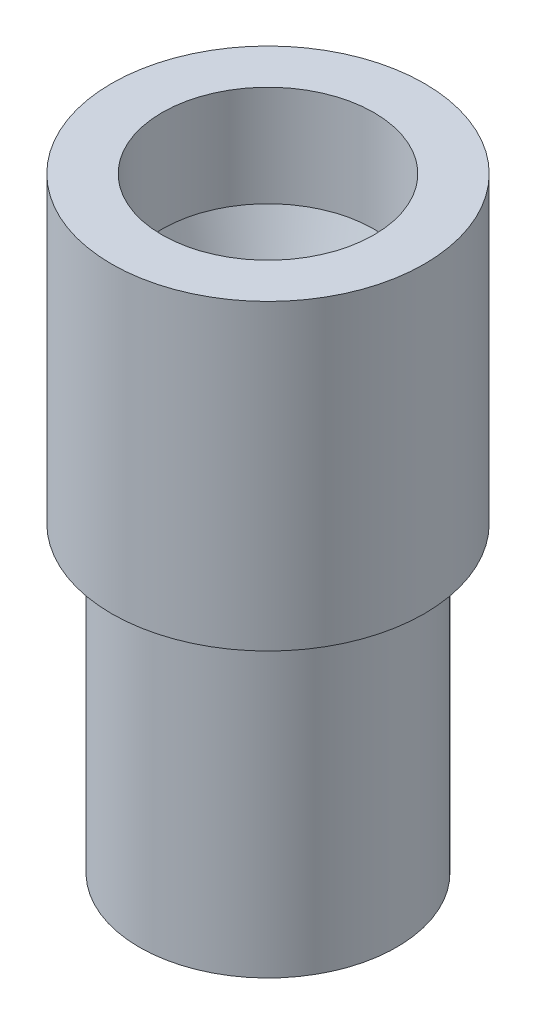
ISO-10303-21;
HEADER;
FILE_DESCRIPTION(('STEP AP214'),'2;1');
FILE_NAME('part.step','',(''),(''),'','','');
FILE_SCHEMA(('AUTOMOTIVE_DESIGN { 1 0 10303 214 1 1 1 1 }'));
ENDSEC;
DATA;
#1=APPLICATION_CONTEXT('core data for automotive mechanical design processes');
#2=APPLICATION_PROTOCOL_DEFINITION('international standard','automotive_design',2000,#1);
#3=PRODUCT_CONTEXT('',#1,'mechanical');
#4=PRODUCT('Part','Part','',(#3));
#5=PRODUCT_RELATED_PRODUCT_CATEGORY('part','',(#4));
#6=PRODUCT_DEFINITION_FORMATION('','',#4);
#7=PRODUCT_DEFINITION_CONTEXT('part definition',#1,'design');
#8=PRODUCT_DEFINITION('design','',#6,#7);
#9=PRODUCT_DEFINITION_SHAPE('','',#8);
#10=(LENGTH_UNIT() NAMED_UNIT(*) SI_UNIT(.MILLI.,.METRE.));
#11=(NAMED_UNIT(*) PLANE_ANGLE_UNIT() SI_UNIT($,.RADIAN.));
#12=(NAMED_UNIT(*) SI_UNIT($,.STERADIAN.) SOLID_ANGLE_UNIT());
#13=UNCERTAINTY_MEASURE_WITH_UNIT(LENGTH_MEASURE(1.E-05),#10,'distance_accuracy_value','');
#14=(GEOMETRIC_REPRESENTATION_CONTEXT(3) GLOBAL_UNCERTAINTY_ASSIGNED_CONTEXT((#13)) GLOBAL_UNIT_ASSIGNED_CONTEXT((#10,
#11,#12)) REPRESENTATION_CONTEXT('',''));
#15=CARTESIAN_POINT('',(0.,0.,0.));
#16=DIRECTION('',(0.,0.,1.));
#17=DIRECTION('',(1.,0.,0.));
#18=AXIS2_PLACEMENT_3D('',#15,#16,#17);
#19=CARTESIAN_POINT('',(0.,15.,0.));
#20=DIRECTION('',(0.,-1.,0.));
#21=DIRECTION('',(0.,0.,-1.));
#22=AXIS2_PLACEMENT_3D('',#19,#20,#21);
#23=CYLINDRICAL_SURFACE('',#22,6.375);
#24=CARTESIAN_POINT('',(0.,15.,0.));
#25=DIRECTION('',(0.,1.,0.));
#26=DIRECTION('',(0.,0.,1.));
#27=AXIS2_PLACEMENT_3D('',#24,#25,#26);
#28=CIRCLE('',#27,6.375);
#29=CARTESIAN_POINT('',(0.,15.,6.375));
#30=VERTEX_POINT('',#29);
#31=EDGE_CURVE('E10',#30,#30,#28,.T.);
#32=ORIENTED_EDGE('',*,*,#31,.F.);
#33=EDGE_LOOP('',(#32));
#34=FACE_BOUND('',#33,.T.);
#35=CARTESIAN_POINT('',(0.,0.,0.));
#36=DIRECTION('',(0.,1.,0.));
#37=DIRECTION('',(0.,0.,1.));
#38=AXIS2_PLACEMENT_3D('',#35,#36,#37);
#39=CIRCLE('',#38,6.375);
#40=CARTESIAN_POINT('',(0.,0.,6.375));
#41=VERTEX_POINT('',#40);
#42=EDGE_CURVE('E38',#41,#41,#39,.T.);
#43=ORIENTED_EDGE('',*,*,#42,.T.);
#44=EDGE_LOOP('',(#43));
#45=FACE_BOUND('',#44,.T.);
#46=ADVANCED_FACE('F31',(#34,#45),#23,.T.);
#47=CARTESIAN_POINT('',(0.,0.,0.));
#48=DIRECTION('',(0.,1.,0.));
#49=DIRECTION('',(0.,0.,1.));
#50=AXIS2_PLACEMENT_3D('',#47,#48,#49);
#51=PLANE('',#50);
#52=CARTESIAN_POINT('',(0.,0.,0.));
#53=DIRECTION('',(0.,-1.,0.));
#54=DIRECTION('',(0.,0.,-1.));
#55=AXIS2_PLACEMENT_3D('',#52,#53,#54);
#56=CIRCLE('',#55,3.875);
#57=CARTESIAN_POINT('',(0.,0.,-3.875));
#58=VERTEX_POINT('',#57);
#59=EDGE_CURVE('E56',#58,#58,#56,.T.);
#60=ORIENTED_EDGE('',*,*,#59,.F.);
#61=EDGE_LOOP('',(#60));
#62=FACE_BOUND('',#61,.T.);
#63=ORIENTED_EDGE('',*,*,#42,.F.);
#64=EDGE_LOOP('',(#63));
#65=FACE_BOUND('',#64,.T.);
#66=ADVANCED_FACE('F75',(#62,#65),#51,.F.);
#67=CARTESIAN_POINT('',(0.,15.,0.));
#68=DIRECTION('',(0.,1.,0.));
#69=DIRECTION('',(0.,0.,1.));
#70=AXIS2_PLACEMENT_3D('',#67,#68,#69);
#71=PLANE('',#70);
#72=CARTESIAN_POINT('',(0.,15.,0.));
#73=DIRECTION('',(0.,1.,0.));
#74=DIRECTION('',(0.,0.,1.));
#75=AXIS2_PLACEMENT_3D('',#72,#73,#74);
#76=CIRCLE('',#75,7.75);
#77=CARTESIAN_POINT('',(0.,15.,7.75));
#78=VERTEX_POINT('',#77);
#79=EDGE_CURVE('E45',#78,#78,#76,.T.);
#80=ORIENTED_EDGE('',*,*,#79,.F.);
#81=EDGE_LOOP('',(#80));
#82=FACE_BOUND('',#81,.T.);
#83=ORIENTED_EDGE('',*,*,#31,.T.);
#84=EDGE_LOOP('',(#83));
#85=FACE_BOUND('',#84,.T.);
#86=ADVANCED_FACE('F80',(#82,#85),#71,.F.);
#87=CARTESIAN_POINT('',(0.,30.,0.));
#88=DIRECTION('',(0.,-1.,0.));
#89=DIRECTION('',(0.,0.,-1.));
#90=AXIS2_PLACEMENT_3D('',#87,#88,#89);
#91=CYLINDRICAL_SURFACE('',#90,7.75);
#92=CARTESIAN_POINT('',(0.,30.,0.));
#93=DIRECTION('',(0.,1.,0.));
#94=DIRECTION('',(0.,0.,1.));
#95=AXIS2_PLACEMENT_3D('',#92,#93,#94);
#96=CIRCLE('',#95,7.75);
#97=CARTESIAN_POINT('',(0.,30.,7.75));
#98=VERTEX_POINT('',#97);
#99=EDGE_CURVE('E43',#98,#98,#96,.T.);
#100=ORIENTED_EDGE('',*,*,#99,.F.);
#101=EDGE_LOOP('',(#100));
#102=FACE_BOUND('',#101,.T.);
#103=ORIENTED_EDGE('',*,*,#79,.T.);
#104=EDGE_LOOP('',(#103));
#105=FACE_BOUND('',#104,.T.);
#106=ADVANCED_FACE('F88',(#102,#105),#91,.T.);
#107=CARTESIAN_POINT('',(0.,30.,0.));
#108=DIRECTION('',(0.,1.,0.));
#109=DIRECTION('',(0.,0.,1.));
#110=AXIS2_PLACEMENT_3D('',#107,#108,#109);
#111=PLANE('',#110);
#112=CARTESIAN_POINT('',(0.,30.,0.));
#113=DIRECTION('',(0.,1.,0.));
#114=DIRECTION('',(0.,0.,1.));
#115=AXIS2_PLACEMENT_3D('',#112,#113,#114);
#116=CIRCLE('',#115,5.25);
#117=CARTESIAN_POINT('',(0.,30.,5.25));
#118=VERTEX_POINT('',#117);
#119=EDGE_CURVE('E48',#118,#118,#116,.T.);
#120=ORIENTED_EDGE('',*,*,#119,.F.);
#121=EDGE_LOOP('',(#120));
#122=FACE_BOUND('',#121,.T.);
#123=ORIENTED_EDGE('',*,*,#99,.T.);
#124=EDGE_LOOP('',(#123));
#125=FACE_BOUND('',#124,.T.);
#126=ADVANCED_FACE('F93',(#122,#125),#111,.T.);
#127=CARTESIAN_POINT('',(0.,25.,0.));
#128=DIRECTION('',(0.,1.,0.));
#129=DIRECTION('',(0.,0.,1.));
#130=AXIS2_PLACEMENT_3D('',#127,#128,#129);
#131=CYLINDRICAL_SURFACE('',#130,5.25);
#132=CARTESIAN_POINT('',(0.,25.,0.));
#133=DIRECTION('',(0.,1.,0.));
#134=DIRECTION('',(0.,0.,1.));
#135=AXIS2_PLACEMENT_3D('',#132,#133,#134);
#136=CIRCLE('',#135,5.25);
#137=CARTESIAN_POINT('',(0.,25.,5.25));
#138=VERTEX_POINT('',#137);
#139=EDGE_CURVE('E53',#138,#138,#136,.T.);
#140=ORIENTED_EDGE('',*,*,#139,.F.);
#141=EDGE_LOOP('',(#140));
#142=FACE_BOUND('',#141,.T.);
#143=ORIENTED_EDGE('',*,*,#119,.T.);
#144=EDGE_LOOP('',(#143));
#145=FACE_BOUND('',#144,.T.);
#146=ADVANCED_FACE('F72',(#142,#145),#131,.F.);
#147=CARTESIAN_POINT('',(0.,25.,0.));
#148=DIRECTION('',(0.,1.,0.));
#149=DIRECTION('',(0.,0.,1.));
#150=AXIS2_PLACEMENT_3D('',#147,#148,#149);
#151=CONICAL_SURFACE('',#150,5.25,0.349065850398867);
#152=CARTESIAN_POINT('',(0.,21.2222185482499,0.));
#153=DIRECTION('',(0.,1.,0.));
#154=DIRECTION('',(0.,0.,1.));
#155=AXIS2_PLACEMENT_3D('',#152,#153,#154);
#156=CIRCLE('',#155,3.875);
#157=CARTESIAN_POINT('',(0.,21.2222185482499,3.875));
#158=VERTEX_POINT('',#157);
#159=EDGE_CURVE('E34',#158,#158,#156,.F.);
#160=ORIENTED_EDGE('',*,*,#159,.T.);
#161=EDGE_LOOP('',(#160));
#162=FACE_BOUND('',#161,.T.);
#163=ORIENTED_EDGE('',*,*,#139,.T.);
#164=EDGE_LOOP('',(#163));
#165=FACE_BOUND('',#164,.T.);
#166=ADVANCED_FACE('F63',(#162,#165),#151,.F.);
#167=CARTESIAN_POINT('',(0.,40.9601551083915,0.));
#168=DIRECTION('',(0.,-1.,0.));
#169=DIRECTION('',(0.,0.,-1.));
#170=AXIS2_PLACEMENT_3D('',#167,#168,#169);
#171=CYLINDRICAL_SURFACE('',#170,3.875);
#172=ORIENTED_EDGE('',*,*,#59,.T.);
#173=EDGE_LOOP('',(#172));
#174=FACE_BOUND('',#173,.T.);
#175=ORIENTED_EDGE('',*,*,#159,.F.);
#176=EDGE_LOOP('',(#175));
#177=FACE_BOUND('',#176,.T.);
#178=ADVANCED_FACE('F66',(#174,#177),#171,.F.);
#179=CLOSED_SHELL('',(#46,#66,#86,#106,#126,#146,#166,#178));
#180=MANIFOLD_SOLID_BREP('B2',#179);
#181=ADVANCED_BREP_SHAPE_REPRESENTATION('',(#18,#180),#14);
#182=SHAPE_DEFINITION_REPRESENTATION(#9,#181);
ENDSEC;
END-ISO-10303-21;
